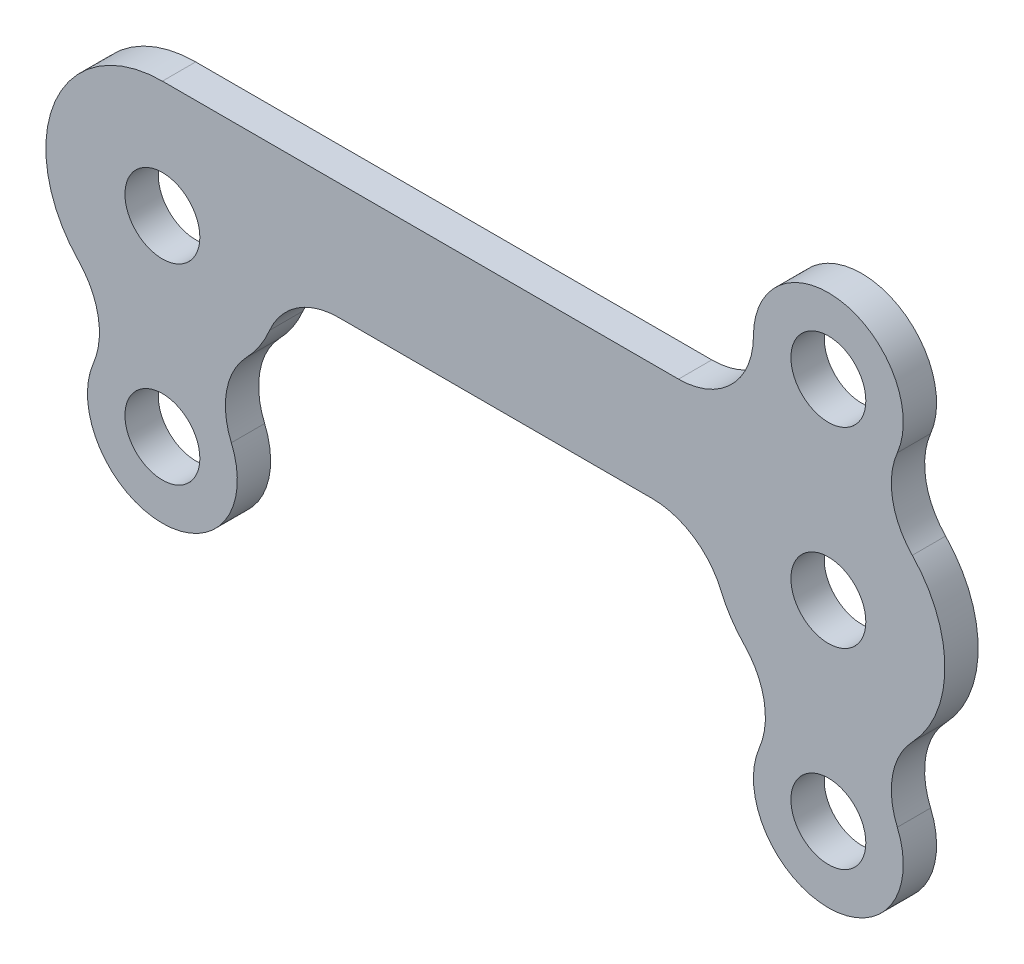
ISO-10303-21;
HEADER;
FILE_DESCRIPTION(('STEP AP214'),'2;1');
FILE_NAME('part.step','',(''),(''),'','','');
FILE_SCHEMA(('AUTOMOTIVE_DESIGN { 1 0 10303 214 1 1 1 1 }'));
ENDSEC;
DATA;
#1=APPLICATION_CONTEXT('core data for automotive mechanical design processes');
#2=APPLICATION_PROTOCOL_DEFINITION('international standard','automotive_design',2000,#1);
#3=PRODUCT_CONTEXT('',#1,'mechanical');
#4=PRODUCT('Part','Part','',(#3));
#5=PRODUCT_RELATED_PRODUCT_CATEGORY('part','',(#4));
#6=PRODUCT_DEFINITION_FORMATION('','',#4);
#7=PRODUCT_DEFINITION_CONTEXT('part definition',#1,'design');
#8=PRODUCT_DEFINITION('design','',#6,#7);
#9=PRODUCT_DEFINITION_SHAPE('','',#8);
#10=(LENGTH_UNIT() NAMED_UNIT(*) SI_UNIT(.MILLI.,.METRE.));
#11=(NAMED_UNIT(*) PLANE_ANGLE_UNIT() SI_UNIT($,.RADIAN.));
#12=(NAMED_UNIT(*) SI_UNIT($,.STERADIAN.) SOLID_ANGLE_UNIT());
#13=UNCERTAINTY_MEASURE_WITH_UNIT(LENGTH_MEASURE(1.E-05),#10,'distance_accuracy_value','');
#14=(GEOMETRIC_REPRESENTATION_CONTEXT(3) GLOBAL_UNCERTAINTY_ASSIGNED_CONTEXT((#13)) GLOBAL_UNIT_ASSIGNED_CONTEXT((#10,
#11,#12)) REPRESENTATION_CONTEXT('',''));
#15=CARTESIAN_POINT('',(0.,0.,0.));
#16=DIRECTION('',(0.,0.,1.));
#17=DIRECTION('',(1.,0.,0.));
#18=AXIS2_PLACEMENT_3D('',#15,#16,#17);
#19=CARTESIAN_POINT('',(31.75,9.128125,1.5875));
#20=DIRECTION('',(0.,0.,-1.));
#21=DIRECTION('',(-1.,0.,0.));
#22=AXIS2_PLACEMENT_3D('',#19,#20,#21);
#23=CYLINDRICAL_SURFACE('',#22,3.57187499999999);
#24=CARTESIAN_POINT('',(31.75,9.128125,0.));
#25=DIRECTION('',(0.,0.,1.));
#26=DIRECTION('',(1.,0.,0.));
#27=AXIS2_PLACEMENT_3D('',#24,#25,#26);
#28=CIRCLE('',#27,3.57187499999999);
#29=CARTESIAN_POINT('',(35.0370584223335,7.7304347826087,0.));
#30=VERTEX_POINT('',#29);
#31=CARTESIAN_POINT('',(28.178125,9.128125,0.));
#32=VERTEX_POINT('',#31);
#33=EDGE_CURVE('E177',#30,#32,#28,.T.);
#34=ORIENTED_EDGE('',*,*,#33,.T.);
#35=DIRECTION('',(0.,0.,-1.));
#36=VECTOR('',#35,1.);
#37=CARTESIAN_POINT('',(28.178125,9.128125,1.5875));
#38=LINE('',#37,#36);
#39=CARTESIAN_POINT('',(28.178125,9.128125,1.5875));
#40=VERTEX_POINT('',#39);
#41=EDGE_CURVE('E175',#40,#32,#38,.T.);
#42=ORIENTED_EDGE('',*,*,#41,.F.);
#43=CARTESIAN_POINT('',(31.75,9.128125,1.5875));
#44=DIRECTION('',(0.,0.,1.));
#45=DIRECTION('',(1.,0.,0.));
#46=AXIS2_PLACEMENT_3D('',#43,#44,#45);
#47=CIRCLE('',#46,3.57187499999999);
#48=CARTESIAN_POINT('',(35.0370584223335,7.7304347826087,1.5875));
#49=VERTEX_POINT('',#48);
#50=EDGE_CURVE('E160',#49,#40,#47,.T.);
#51=ORIENTED_EDGE('',*,*,#50,.F.);
#52=DIRECTION('',(0.,0.,-1.));
#53=VECTOR('',#52,1.);
#54=CARTESIAN_POINT('',(35.0370584223335,7.7304347826087,1.5875));
#55=LINE('',#54,#53);
#56=EDGE_CURVE('E244',#49,#30,#55,.T.);
#57=ORIENTED_EDGE('',*,*,#56,.T.);
#58=EDGE_LOOP('',(#34,#42,#51,#57));
#59=FACE_BOUND('',#58,.T.);
#60=ADVANCED_FACE('F41',(#59),#23,.T.);
#61=CARTESIAN_POINT('',(24.60625,9.128125,1.5875));
#62=DIRECTION('',(0.,0.,-1.));
#63=DIRECTION('',(-1.,0.,0.));
#64=AXIS2_PLACEMENT_3D('',#61,#62,#63);
#65=CYLINDRICAL_SURFACE('',#64,3.571875);
#66=CARTESIAN_POINT('',(24.60625,9.128125,0.));
#67=DIRECTION('',(0.,0.,1.));
#68=DIRECTION('',(1.,0.,0.));
#69=AXIS2_PLACEMENT_3D('',#66,#67,#68);
#70=CIRCLE('',#69,3.571875);
#71=CARTESIAN_POINT('',(24.60625,5.55625,0.));
#72=VERTEX_POINT('',#71);
#73=EDGE_CURVE('E251',#72,#32,#70,.T.);
#74=ORIENTED_EDGE('',*,*,#73,.F.);
#75=DIRECTION('',(0.,0.,-1.));
#76=VECTOR('',#75,1.);
#77=CARTESIAN_POINT('',(24.60625,5.55625,1.5875));
#78=LINE('',#77,#76);
#79=CARTESIAN_POINT('',(24.60625,5.55625,1.5875));
#80=VERTEX_POINT('',#79);
#81=EDGE_CURVE('E183',#80,#72,#78,.T.);
#82=ORIENTED_EDGE('',*,*,#81,.F.);
#83=CARTESIAN_POINT('',(24.60625,9.128125,1.5875));
#84=DIRECTION('',(0.,0.,1.));
#85=DIRECTION('',(1.,0.,0.));
#86=AXIS2_PLACEMENT_3D('',#83,#84,#85);
#87=CIRCLE('',#86,3.571875);
#88=EDGE_CURVE('E166',#80,#40,#87,.T.);
#89=ORIENTED_EDGE('',*,*,#88,.T.);
#90=ORIENTED_EDGE('',*,*,#41,.T.);
#91=EDGE_LOOP('',(#74,#82,#89,#90));
#92=FACE_BOUND('',#91,.T.);
#93=ADVANCED_FACE('F185',(#92),#65,.F.);
#94=CARTESIAN_POINT('',(0.,5.55625000000001,1.5875));
#95=DIRECTION('',(0.,1.,0.));
#96=DIRECTION('',(-1.,0.,0.));
#97=AXIS2_PLACEMENT_3D('',#94,#95,#96);
#98=PLANE('',#97);
#99=DIRECTION('',(1.,0.,0.));
#100=VECTOR('',#99,1.);
#101=CARTESIAN_POINT('',(0.,5.55625000000001,0.));
#102=LINE('',#101,#100);
#103=CARTESIAN_POINT('',(0.,5.55625000000001,0.));
#104=VERTEX_POINT('',#103);
#105=EDGE_CURVE('E254',#104,#72,#102,.T.);
#106=ORIENTED_EDGE('',*,*,#105,.F.);
#107=DIRECTION('',(0.,0.,-1.));
#108=VECTOR('',#107,1.);
#109=CARTESIAN_POINT('',(0.,5.55625000000001,1.5875));
#110=LINE('',#109,#108);
#111=CARTESIAN_POINT('',(0.,5.55625000000001,1.5875));
#112=VERTEX_POINT('',#111);
#113=EDGE_CURVE('E345',#112,#104,#110,.T.);
#114=ORIENTED_EDGE('',*,*,#113,.F.);
#115=DIRECTION('',(1.,0.,0.));
#116=VECTOR('',#115,1.);
#117=CARTESIAN_POINT('',(0.,5.55625000000001,1.5875));
#118=LINE('',#117,#116);
#119=EDGE_CURVE('E187',#112,#80,#118,.T.);
#120=ORIENTED_EDGE('',*,*,#119,.T.);
#121=ORIENTED_EDGE('',*,*,#81,.T.);
#122=EDGE_LOOP('',(#106,#114,#120,#121));
#123=FACE_BOUND('',#122,.T.);
#124=ADVANCED_FACE('F406',(#123),#98,.T.);
#125=CARTESIAN_POINT('',(0.,0.,1.5875));
#126=DIRECTION('',(0.,0.,-1.));
#127=DIRECTION('',(-1.,0.,0.));
#128=AXIS2_PLACEMENT_3D('',#125,#126,#127);
#129=CYLINDRICAL_SURFACE('',#128,5.55625);
#130=CARTESIAN_POINT('',(0.,0.,0.));
#131=DIRECTION('',(0.,0.,1.));
#132=DIRECTION('',(1.,0.,0.));
#133=AXIS2_PLACEMENT_3D('',#130,#131,#132);
#134=CIRCLE('',#133,5.55625);
#135=CARTESIAN_POINT('',(-4.0016363402321,-3.8547140831758,0.));
#136=VERTEX_POINT('',#135);
#137=EDGE_CURVE('E258',#104,#136,#134,.T.);
#138=ORIENTED_EDGE('',*,*,#137,.T.);
#139=DIRECTION('',(0.,0.,-1.));
#140=VECTOR('',#139,1.);
#141=CARTESIAN_POINT('',(-4.0016363402321,-3.8547140831758,1.5875));
#142=LINE('',#141,#140);
#143=CARTESIAN_POINT('',(-4.0016363402321,-3.8547140831758,1.5875));
#144=VERTEX_POINT('',#143);
#145=EDGE_CURVE('E342',#144,#136,#142,.T.);
#146=ORIENTED_EDGE('',*,*,#145,.F.);
#147=CARTESIAN_POINT('',(0.,0.,1.5875));
#148=DIRECTION('',(0.,0.,1.));
#149=DIRECTION('',(1.,0.,0.));
#150=AXIS2_PLACEMENT_3D('',#147,#148,#149);
#151=CIRCLE('',#150,5.55625);
#152=EDGE_CURVE('E190',#112,#144,#151,.T.);
#153=ORIENTED_EDGE('',*,*,#152,.F.);
#154=ORIENTED_EDGE('',*,*,#113,.T.);
#155=EDGE_LOOP('',(#138,#146,#153,#154));
#156=FACE_BOUND('',#155,.T.);
#157=ADVANCED_FACE('F411',(#156),#129,.T.);
#158=CARTESIAN_POINT('',(-6.57411684466701,-6.33274456521739,1.5875));
#159=DIRECTION('',(0.,0.,-1.));
#160=DIRECTION('',(-1.,0.,0.));
#161=AXIS2_PLACEMENT_3D('',#158,#159,#160);
#162=CYLINDRICAL_SURFACE('',#161,3.57187499999999);
#163=CARTESIAN_POINT('',(-6.57411684466701,-6.33274456521739,0.));
#164=DIRECTION('',(0.,0.,1.));
#165=DIRECTION('',(1.,0.,0.));
#166=AXIS2_PLACEMENT_3D('',#163,#164,#165);
#167=CIRCLE('',#166,3.57187499999999);
#168=CARTESIAN_POINT('',(-3.2870584223335,-7.73043478260869,0.));
#169=VERTEX_POINT('',#168);
#170=EDGE_CURVE('E262',#169,#136,#167,.T.);
#171=ORIENTED_EDGE('',*,*,#170,.F.);
#172=DIRECTION('',(0.,0.,-1.));
#173=VECTOR('',#172,1.);
#174=CARTESIAN_POINT('',(-3.2870584223335,-7.73043478260869,1.5875));
#175=LINE('',#174,#173);
#176=CARTESIAN_POINT('',(-3.2870584223335,-7.73043478260869,1.5875));
#177=VERTEX_POINT('',#176);
#178=EDGE_CURVE('E339',#177,#169,#175,.T.);
#179=ORIENTED_EDGE('',*,*,#178,.F.);
#180=CARTESIAN_POINT('',(-6.57411684466701,-6.33274456521739,1.5875));
#181=DIRECTION('',(0.,0.,1.));
#182=DIRECTION('',(1.,0.,0.));
#183=AXIS2_PLACEMENT_3D('',#180,#181,#182);
#184=CIRCLE('',#183,3.57187499999999);
#185=EDGE_CURVE('E196',#177,#144,#184,.T.);
#186=ORIENTED_EDGE('',*,*,#185,.T.);
#187=ORIENTED_EDGE('',*,*,#145,.T.);
#188=EDGE_LOOP('',(#171,#179,#186,#187));
#189=FACE_BOUND('',#188,.T.);
#190=ADVANCED_FACE('F414',(#189),#162,.F.);
#191=CARTESIAN_POINT('',(0.,-9.128125,1.5875));
#192=DIRECTION('',(0.,0.,-1.));
#193=DIRECTION('',(-1.,0.,0.));
#194=AXIS2_PLACEMENT_3D('',#191,#192,#193);
#195=CYLINDRICAL_SURFACE('',#194,3.57187499999999);
#196=CARTESIAN_POINT('',(0.,-9.128125,0.));
#197=DIRECTION('',(0.,0.,1.));
#198=DIRECTION('',(1.,0.,0.));
#199=AXIS2_PLACEMENT_3D('',#196,#197,#198);
#200=CIRCLE('',#199,3.57187499999999);
#201=CARTESIAN_POINT('',(3.2870584223335,-7.73043478260869,0.));
#202=VERTEX_POINT('',#201);
#203=EDGE_CURVE('E267',#169,#202,#200,.T.);
#204=ORIENTED_EDGE('',*,*,#203,.T.);
#205=DIRECTION('',(0.,0.,-1.));
#206=VECTOR('',#205,1.);
#207=CARTESIAN_POINT('',(3.2870584223335,-7.73043478260869,1.5875));
#208=LINE('',#207,#206);
#209=CARTESIAN_POINT('',(3.2870584223335,-7.73043478260869,1.5875));
#210=VERTEX_POINT('',#209);
#211=EDGE_CURVE('E336',#210,#202,#208,.T.);
#212=ORIENTED_EDGE('',*,*,#211,.F.);
#213=CARTESIAN_POINT('',(0.,-9.128125,1.5875));
#214=DIRECTION('',(0.,0.,1.));
#215=DIRECTION('',(1.,0.,0.));
#216=AXIS2_PLACEMENT_3D('',#213,#214,#215);
#217=CIRCLE('',#216,3.57187499999999);
#218=EDGE_CURVE('E201',#177,#210,#217,.T.);
#219=ORIENTED_EDGE('',*,*,#218,.F.);
#220=ORIENTED_EDGE('',*,*,#178,.T.);
#221=EDGE_LOOP('',(#204,#212,#219,#220));
#222=FACE_BOUND('',#221,.T.);
#223=ADVANCED_FACE('F419',(#222),#195,.T.);
#224=CARTESIAN_POINT('',(6.57411684466701,-6.33274456521739,1.5875));
#225=DIRECTION('',(0.,0.,-1.));
#226=DIRECTION('',(-1.,0.,0.));
#227=AXIS2_PLACEMENT_3D('',#224,#225,#226);
#228=CYLINDRICAL_SURFACE('',#227,3.57187500000001);
#229=CARTESIAN_POINT('',(6.57411684466701,-6.33274456521739,0.));
#230=DIRECTION('',(0.,0.,1.));
#231=DIRECTION('',(1.,0.,0.));
#232=AXIS2_PLACEMENT_3D('',#229,#230,#231);
#233=CIRCLE('',#232,3.57187500000001);
#234=CARTESIAN_POINT('',(4.0016363402321,-3.8547140831758,0.));
#235=VERTEX_POINT('',#234);
#236=EDGE_CURVE('E271',#235,#202,#233,.T.);
#237=ORIENTED_EDGE('',*,*,#236,.F.);
#238=DIRECTION('',(0.,0.,-1.));
#239=VECTOR('',#238,1.);
#240=CARTESIAN_POINT('',(4.0016363402321,-3.8547140831758,1.5875));
#241=LINE('',#240,#239);
#242=CARTESIAN_POINT('',(4.0016363402321,-3.8547140831758,1.5875));
#243=VERTEX_POINT('',#242);
#244=EDGE_CURVE('E333',#243,#235,#241,.T.);
#245=ORIENTED_EDGE('',*,*,#244,.F.);
#246=CARTESIAN_POINT('',(6.57411684466701,-6.33274456521739,1.5875));
#247=DIRECTION('',(0.,0.,1.));
#248=DIRECTION('',(1.,0.,0.));
#249=AXIS2_PLACEMENT_3D('',#246,#247,#248);
#250=CIRCLE('',#249,3.57187500000001);
#251=EDGE_CURVE('E204',#243,#210,#250,.T.);
#252=ORIENTED_EDGE('',*,*,#251,.T.);
#253=ORIENTED_EDGE('',*,*,#211,.T.);
#254=EDGE_LOOP('',(#237,#245,#252,#253));
#255=FACE_BOUND('',#254,.T.);
#256=ADVANCED_FACE('F426',(#255),#228,.F.);
#257=CARTESIAN_POINT('',(5.11320199029657,-2.1741847826087,0.));
#258=VERTEX_POINT('',#257);
#259=EDGE_CURVE('E263',#235,#258,#134,.T.);
#260=ORIENTED_EDGE('',*,*,#259,.T.);
#261=DIRECTION('',(0.,0.,-1.));
#262=VECTOR('',#261,1.);
#263=CARTESIAN_POINT('',(5.11320199029657,-2.1741847826087,1.5875));
#264=LINE('',#263,#262);
#265=CARTESIAN_POINT('',(5.11320199029657,-2.1741847826087,1.5875));
#266=VERTEX_POINT('',#265);
#267=EDGE_CURVE('E356',#258,#266,#264,.F.);
#268=ORIENTED_EDGE('',*,*,#267,.T.);
#269=EDGE_CURVE('E197',#243,#266,#151,.T.);
#270=ORIENTED_EDGE('',*,*,#269,.F.);
#271=ORIENTED_EDGE('',*,*,#244,.T.);
#272=EDGE_LOOP('',(#260,#268,#270,#271));
#273=FACE_BOUND('',#272,.T.);
#274=ADVANCED_FACE('F430',(#273),#129,.T.);
#275=CARTESIAN_POINT('',(0.,0.,1.5875));
#276=DIRECTION('',(0.,1.,0.));
#277=DIRECTION('',(0.,0.,1.));
#278=AXIS2_PLACEMENT_3D('',#275,#276,#277);
#279=PLANE('',#278);
#280=DIRECTION('',(1.,0.,0.));
#281=VECTOR('',#280,1.);
#282=CARTESIAN_POINT('',(0.,0.,1.5875));
#283=LINE('',#282,#281);
#284=CARTESIAN_POINT('',(8.40026041263008,0.,1.5875));
#285=VERTEX_POINT('',#284);
#286=CARTESIAN_POINT('',(23.3497395873699,0.,1.5875));
#287=VERTEX_POINT('',#286);
#288=EDGE_CURVE('E208',#285,#287,#283,.T.);
#289=ORIENTED_EDGE('',*,*,#288,.F.);
#290=DIRECTION('',(0.,0.,1.));
#291=VECTOR('',#290,1.);
#292=CARTESIAN_POINT('',(8.40026041263008,0.,0.));
#293=LINE('',#292,#291);
#294=CARTESIAN_POINT('',(8.40026041263008,0.,0.));
#295=VERTEX_POINT('',#294);
#296=EDGE_CURVE('E352',#285,#295,#293,.F.);
#297=ORIENTED_EDGE('',*,*,#296,.T.);
#298=DIRECTION('',(1.,0.,0.));
#299=VECTOR('',#298,1.);
#300=CARTESIAN_POINT('',(0.,0.,0.));
#301=LINE('',#300,#299);
#302=CARTESIAN_POINT('',(23.3497395873699,0.,0.));
#303=VERTEX_POINT('',#302);
#304=EDGE_CURVE('E275',#295,#303,#301,.T.);
#305=ORIENTED_EDGE('',*,*,#304,.T.);
#306=DIRECTION('',(0.,0.,1.));
#307=VECTOR('',#306,1.);
#308=CARTESIAN_POINT('',(23.3497395873699,0.,1.5875));
#309=LINE('',#308,#307);
#310=EDGE_CURVE('E182',#303,#287,#309,.T.);
#311=ORIENTED_EDGE('',*,*,#310,.T.);
#312=EDGE_LOOP('',(#289,#297,#305,#311));
#313=FACE_BOUND('',#312,.T.);
#314=ADVANCED_FACE('F375',(#313),#279,.F.);
#315=CARTESIAN_POINT('',(31.75,0.,1.5875));
#316=DIRECTION('',(0.,0.,-1.));
#317=DIRECTION('',(-1.,0.,0.));
#318=AXIS2_PLACEMENT_3D('',#315,#316,#317);
#319=CYLINDRICAL_SURFACE('',#318,5.55625);
#320=CARTESIAN_POINT('',(31.75,0.,1.5875));
#321=DIRECTION('',(0.,0.,1.));
#322=DIRECTION('',(1.,0.,0.));
#323=AXIS2_PLACEMENT_3D('',#320,#321,#322);
#324=CIRCLE('',#323,5.55625);
#325=CARTESIAN_POINT('',(26.6367980097034,-2.17418478260869,1.5875));
#326=VERTEX_POINT('',#325);
#327=CARTESIAN_POINT('',(27.7483636597679,-3.8547140831758,1.5875));
#328=VERTEX_POINT('',#327);
#329=EDGE_CURVE('E211',#326,#328,#324,.T.);
#330=ORIENTED_EDGE('',*,*,#329,.F.);
#331=DIRECTION('',(0.,0.,-1.));
#332=VECTOR('',#331,1.);
#333=CARTESIAN_POINT('',(26.6367980097034,-2.17418478260869,1.5875));
#334=LINE('',#333,#332);
#335=CARTESIAN_POINT('',(26.6367980097034,-2.17418478260869,0.));
#336=VERTEX_POINT('',#335);
#337=EDGE_CURVE('E359',#326,#336,#334,.T.);
#338=ORIENTED_EDGE('',*,*,#337,.T.);
#339=CARTESIAN_POINT('',(31.75,0.,0.));
#340=DIRECTION('',(0.,0.,1.));
#341=DIRECTION('',(1.,0.,0.));
#342=AXIS2_PLACEMENT_3D('',#339,#340,#341);
#343=CIRCLE('',#342,5.55625);
#344=CARTESIAN_POINT('',(27.7483636597679,-3.8547140831758,0.));
#345=VERTEX_POINT('',#344);
#346=EDGE_CURVE('E279',#336,#345,#343,.T.);
#347=ORIENTED_EDGE('',*,*,#346,.T.);
#348=DIRECTION('',(0.,0.,-1.));
#349=VECTOR('',#348,1.);
#350=CARTESIAN_POINT('',(27.7483636597679,-3.8547140831758,1.5875));
#351=LINE('',#350,#349);
#352=EDGE_CURVE('E329',#328,#345,#351,.T.);
#353=ORIENTED_EDGE('',*,*,#352,.F.);
#354=EDGE_LOOP('',(#330,#338,#347,#353));
#355=FACE_BOUND('',#354,.T.);
#356=ADVANCED_FACE('F378',(#355),#319,.T.);
#357=CARTESIAN_POINT('',(25.175883155333,-6.33274456521739,1.5875));
#358=DIRECTION('',(0.,0.,-1.));
#359=DIRECTION('',(-1.,0.,0.));
#360=AXIS2_PLACEMENT_3D('',#357,#358,#359);
#361=CYLINDRICAL_SURFACE('',#360,3.57187499999999);
#362=CARTESIAN_POINT('',(25.175883155333,-6.33274456521739,0.));
#363=DIRECTION('',(0.,0.,1.));
#364=DIRECTION('',(1.,0.,0.));
#365=AXIS2_PLACEMENT_3D('',#362,#363,#364);
#366=CIRCLE('',#365,3.57187499999999);
#367=CARTESIAN_POINT('',(28.4629415776665,-7.73043478260869,0.));
#368=VERTEX_POINT('',#367);
#369=EDGE_CURVE('E282',#368,#345,#366,.T.);
#370=ORIENTED_EDGE('',*,*,#369,.F.);
#371=DIRECTION('',(0.,0.,-1.));
#372=VECTOR('',#371,1.);
#373=CARTESIAN_POINT('',(28.4629415776665,-7.73043478260869,1.5875));
#374=LINE('',#373,#372);
#375=CARTESIAN_POINT('',(28.4629415776665,-7.73043478260869,1.5875));
#376=VERTEX_POINT('',#375);
#377=EDGE_CURVE('E326',#376,#368,#374,.T.);
#378=ORIENTED_EDGE('',*,*,#377,.F.);
#379=CARTESIAN_POINT('',(25.175883155333,-6.33274456521739,1.5875));
#380=DIRECTION('',(0.,0.,1.));
#381=DIRECTION('',(1.,0.,0.));
#382=AXIS2_PLACEMENT_3D('',#379,#380,#381);
#383=CIRCLE('',#382,3.57187499999999);
#384=EDGE_CURVE('E214',#376,#328,#383,.T.);
#385=ORIENTED_EDGE('',*,*,#384,.T.);
#386=ORIENTED_EDGE('',*,*,#352,.T.);
#387=EDGE_LOOP('',(#370,#378,#385,#386));
#388=FACE_BOUND('',#387,.T.);
#389=ADVANCED_FACE('F386',(#388),#361,.F.);
#390=CARTESIAN_POINT('',(31.75,-9.128125,1.5875));
#391=DIRECTION('',(0.,0.,-1.));
#392=DIRECTION('',(-1.,0.,0.));
#393=AXIS2_PLACEMENT_3D('',#390,#391,#392);
#394=CYLINDRICAL_SURFACE('',#393,3.57187499999999);
#395=CARTESIAN_POINT('',(31.75,-9.128125,0.));
#396=DIRECTION('',(0.,0.,1.));
#397=DIRECTION('',(1.,0.,0.));
#398=AXIS2_PLACEMENT_3D('',#395,#396,#397);
#399=CIRCLE('',#398,3.57187499999999);
#400=CARTESIAN_POINT('',(35.0370584223335,-7.73043478260869,0.));
#401=VERTEX_POINT('',#400);
#402=EDGE_CURVE('E287',#368,#401,#399,.T.);
#403=ORIENTED_EDGE('',*,*,#402,.T.);
#404=DIRECTION('',(0.,0.,-1.));
#405=VECTOR('',#404,1.);
#406=CARTESIAN_POINT('',(35.0370584223335,-7.73043478260869,1.5875));
#407=LINE('',#406,#405);
#408=CARTESIAN_POINT('',(35.0370584223335,-7.73043478260869,1.5875));
#409=VERTEX_POINT('',#408);
#410=EDGE_CURVE('E323',#409,#401,#407,.T.);
#411=ORIENTED_EDGE('',*,*,#410,.F.);
#412=CARTESIAN_POINT('',(31.75,-9.128125,1.5875));
#413=DIRECTION('',(0.,0.,1.));
#414=DIRECTION('',(1.,0.,0.));
#415=AXIS2_PLACEMENT_3D('',#412,#413,#414);
#416=CIRCLE('',#415,3.57187499999999);
#417=EDGE_CURVE('E219',#376,#409,#416,.T.);
#418=ORIENTED_EDGE('',*,*,#417,.F.);
#419=ORIENTED_EDGE('',*,*,#377,.T.);
#420=EDGE_LOOP('',(#403,#411,#418,#419));
#421=FACE_BOUND('',#420,.T.);
#422=ADVANCED_FACE('F389',(#421),#394,.T.);
#423=CARTESIAN_POINT('',(38.324116844667,-6.33274456521739,1.5875));
#424=DIRECTION('',(0.,0.,-1.));
#425=DIRECTION('',(-1.,0.,0.));
#426=AXIS2_PLACEMENT_3D('',#423,#424,#425);
#427=CYLINDRICAL_SURFACE('',#426,3.571875);
#428=CARTESIAN_POINT('',(38.324116844667,-6.33274456521739,0.));
#429=DIRECTION('',(0.,0.,1.));
#430=DIRECTION('',(1.,0.,0.));
#431=AXIS2_PLACEMENT_3D('',#428,#429,#430);
#432=CIRCLE('',#431,3.571875);
#433=CARTESIAN_POINT('',(35.7516363402321,-3.8547140831758,0.));
#434=VERTEX_POINT('',#433);
#435=EDGE_CURVE('E291',#434,#401,#432,.T.);
#436=ORIENTED_EDGE('',*,*,#435,.F.);
#437=DIRECTION('',(0.,0.,-1.));
#438=VECTOR('',#437,1.);
#439=CARTESIAN_POINT('',(35.7516363402321,-3.8547140831758,1.5875));
#440=LINE('',#439,#438);
#441=CARTESIAN_POINT('',(35.7516363402321,-3.8547140831758,1.5875));
#442=VERTEX_POINT('',#441);
#443=EDGE_CURVE('E320',#442,#434,#440,.T.);
#444=ORIENTED_EDGE('',*,*,#443,.F.);
#445=CARTESIAN_POINT('',(38.324116844667,-6.33274456521739,1.5875));
#446=DIRECTION('',(0.,0.,1.));
#447=DIRECTION('',(1.,0.,0.));
#448=AXIS2_PLACEMENT_3D('',#445,#446,#447);
#449=CIRCLE('',#448,3.571875);
#450=EDGE_CURVE('E222',#442,#409,#449,.T.);
#451=ORIENTED_EDGE('',*,*,#450,.T.);
#452=ORIENTED_EDGE('',*,*,#410,.T.);
#453=EDGE_LOOP('',(#436,#444,#451,#452));
#454=FACE_BOUND('',#453,.T.);
#455=ADVANCED_FACE('F392',(#454),#427,.F.);
#456=CARTESIAN_POINT('',(35.7516363402321,3.85471408317581,0.));
#457=VERTEX_POINT('',#456);
#458=EDGE_CURVE('E283',#434,#457,#343,.T.);
#459=ORIENTED_EDGE('',*,*,#458,.T.);
#460=DIRECTION('',(0.,0.,-1.));
#461=VECTOR('',#460,1.);
#462=CARTESIAN_POINT('',(35.7516363402321,3.85471408317581,1.5875));
#463=LINE('',#462,#461);
#464=CARTESIAN_POINT('',(35.7516363402321,3.85471408317581,1.5875));
#465=VERTEX_POINT('',#464);
#466=EDGE_CURVE('E317',#465,#457,#463,.T.);
#467=ORIENTED_EDGE('',*,*,#466,.F.);
#468=EDGE_CURVE('E215',#442,#465,#324,.T.);
#469=ORIENTED_EDGE('',*,*,#468,.F.);
#470=ORIENTED_EDGE('',*,*,#443,.T.);
#471=EDGE_LOOP('',(#459,#467,#469,#470));
#472=FACE_BOUND('',#471,.T.);
#473=ADVANCED_FACE('F398',(#472),#319,.T.);
#474=CARTESIAN_POINT('',(0.,-9.128125,1.5875));
#475=DIRECTION('',(0.,0.,-1.));
#476=DIRECTION('',(-1.,0.,0.));
#477=AXIS2_PLACEMENT_3D('',#474,#475,#476);
#478=CYLINDRICAL_SURFACE('',#477,1.7859375);
#479=CARTESIAN_POINT('',(0.,-9.128125,1.5875));
#480=DIRECTION('',(0.,0.,1.));
#481=DIRECTION('',(1.,0.,0.));
#482=AXIS2_PLACEMENT_3D('',#479,#480,#481);
#483=CIRCLE('',#482,1.7859375);
#484=CARTESIAN_POINT('',(1.7859375,-9.128125,1.5875));
#485=VERTEX_POINT('',#484);
#486=EDGE_CURVE('E236',#485,#485,#483,.T.);
#487=ORIENTED_EDGE('',*,*,#486,.T.);
#488=EDGE_LOOP('',(#487));
#489=FACE_BOUND('',#488,.T.);
#490=CARTESIAN_POINT('',(0.,-9.128125,0.));
#491=DIRECTION('',(0.,0.,1.));
#492=DIRECTION('',(1.,0.,0.));
#493=AXIS2_PLACEMENT_3D('',#490,#491,#492);
#494=CIRCLE('',#493,1.7859375);
#495=CARTESIAN_POINT('',(1.7859375,-9.128125,0.));
#496=VERTEX_POINT('',#495);
#497=EDGE_CURVE('E307',#496,#496,#494,.T.);
#498=ORIENTED_EDGE('',*,*,#497,.F.);
#499=EDGE_LOOP('',(#498));
#500=FACE_BOUND('',#499,.T.);
#501=ADVANCED_FACE('F557',(#489,#500),#478,.F.);
#502=CARTESIAN_POINT('',(31.75,0.,1.5875));
#503=DIRECTION('',(0.,0.,-1.));
#504=DIRECTION('',(-1.,0.,0.));
#505=AXIS2_PLACEMENT_3D('',#502,#503,#504);
#506=CYLINDRICAL_SURFACE('',#505,1.7859375);
#507=CARTESIAN_POINT('',(31.75,0.,1.5875));
#508=DIRECTION('',(0.,0.,1.));
#509=DIRECTION('',(1.,0.,0.));
#510=AXIS2_PLACEMENT_3D('',#507,#508,#509);
#511=CIRCLE('',#510,1.7859375);
#512=CARTESIAN_POINT('',(33.5359375,0.,1.5875));
#513=VERTEX_POINT('',#512);
#514=EDGE_CURVE('E232',#513,#513,#511,.T.);
#515=ORIENTED_EDGE('',*,*,#514,.T.);
#516=EDGE_LOOP('',(#515));
#517=FACE_BOUND('',#516,.T.);
#518=CARTESIAN_POINT('',(31.75,0.,0.));
#519=DIRECTION('',(0.,0.,1.));
#520=DIRECTION('',(1.,0.,0.));
#521=AXIS2_PLACEMENT_3D('',#518,#519,#520);
#522=CIRCLE('',#521,1.7859375);
#523=CARTESIAN_POINT('',(33.5359375,0.,0.));
#524=VERTEX_POINT('',#523);
#525=EDGE_CURVE('E303',#524,#524,#522,.T.);
#526=ORIENTED_EDGE('',*,*,#525,.F.);
#527=EDGE_LOOP('',(#526));
#528=FACE_BOUND('',#527,.T.);
#529=ADVANCED_FACE('F547',(#517,#528),#506,.F.);
#530=CARTESIAN_POINT('',(0.,0.,1.5875));
#531=DIRECTION('',(0.,0.,-1.));
#532=DIRECTION('',(-1.,0.,0.));
#533=AXIS2_PLACEMENT_3D('',#530,#531,#532);
#534=CYLINDRICAL_SURFACE('',#533,1.7859375);
#535=CARTESIAN_POINT('',(0.,0.,1.5875));
#536=DIRECTION('',(0.,0.,1.));
#537=DIRECTION('',(1.,0.,0.));
#538=AXIS2_PLACEMENT_3D('',#535,#536,#537);
#539=CIRCLE('',#538,1.7859375);
#540=CARTESIAN_POINT('',(1.7859375,0.,1.5875));
#541=VERTEX_POINT('',#540);
#542=EDGE_CURVE('E228',#541,#541,#539,.T.);
#543=ORIENTED_EDGE('',*,*,#542,.T.);
#544=EDGE_LOOP('',(#543));
#545=FACE_BOUND('',#544,.T.);
#546=CARTESIAN_POINT('',(0.,0.,0.));
#547=DIRECTION('',(0.,0.,1.));
#548=DIRECTION('',(1.,0.,0.));
#549=AXIS2_PLACEMENT_3D('',#546,#547,#548);
#550=CIRCLE('',#549,1.7859375);
#551=CARTESIAN_POINT('',(1.7859375,0.,0.));
#552=VERTEX_POINT('',#551);
#553=EDGE_CURVE('E299',#552,#552,#550,.T.);
#554=ORIENTED_EDGE('',*,*,#553,.F.);
#555=EDGE_LOOP('',(#554));
#556=FACE_BOUND('',#555,.T.);
#557=ADVANCED_FACE('F538',(#545,#556),#534,.F.);
#558=CARTESIAN_POINT('',(38.324116844667,6.33274456521739,1.5875));
#559=DIRECTION('',(0.,0.,-1.));
#560=DIRECTION('',(-1.,0.,0.));
#561=AXIS2_PLACEMENT_3D('',#558,#559,#560);
#562=CYLINDRICAL_SURFACE('',#561,3.571875);
#563=CARTESIAN_POINT('',(38.324116844667,6.33274456521739,0.));
#564=DIRECTION('',(0.,0.,1.));
#565=DIRECTION('',(1.,0.,0.));
#566=AXIS2_PLACEMENT_3D('',#563,#564,#565);
#567=CIRCLE('',#566,3.571875);
#568=EDGE_CURVE('E295',#30,#457,#567,.T.);
#569=ORIENTED_EDGE('',*,*,#568,.F.);
#570=ORIENTED_EDGE('',*,*,#56,.F.);
#571=CARTESIAN_POINT('',(38.324116844667,6.33274456521739,1.5875));
#572=DIRECTION('',(0.,0.,1.));
#573=DIRECTION('',(1.,0.,0.));
#574=AXIS2_PLACEMENT_3D('',#571,#572,#573);
#575=CIRCLE('',#574,3.571875);
#576=EDGE_CURVE('E169',#49,#465,#575,.T.);
#577=ORIENTED_EDGE('',*,*,#576,.T.);
#578=ORIENTED_EDGE('',*,*,#466,.T.);
#579=EDGE_LOOP('',(#569,#570,#577,#578));
#580=FACE_BOUND('',#579,.T.);
#581=ADVANCED_FACE('F402',(#580),#562,.F.);
#582=CARTESIAN_POINT('',(31.75,9.128125,1.5875));
#583=DIRECTION('',(0.,0.,-1.));
#584=DIRECTION('',(-1.,0.,0.));
#585=AXIS2_PLACEMENT_3D('',#582,#583,#584);
#586=CYLINDRICAL_SURFACE('',#585,1.7859375);
#587=CARTESIAN_POINT('',(31.75,9.128125,1.5875));
#588=DIRECTION('',(0.,0.,1.));
#589=DIRECTION('',(1.,0.,0.));
#590=AXIS2_PLACEMENT_3D('',#587,#588,#589);
#591=CIRCLE('',#590,1.7859375);
#592=CARTESIAN_POINT('',(33.5359375,9.128125,1.5875));
#593=VERTEX_POINT('',#592);
#594=EDGE_CURVE('E172',#593,#593,#591,.T.);
#595=ORIENTED_EDGE('',*,*,#594,.T.);
#596=EDGE_LOOP('',(#595));
#597=FACE_BOUND('',#596,.T.);
#598=CARTESIAN_POINT('',(31.75,9.128125,0.));
#599=DIRECTION('',(0.,0.,1.));
#600=DIRECTION('',(1.,0.,0.));
#601=AXIS2_PLACEMENT_3D('',#598,#599,#600);
#602=CIRCLE('',#601,1.7859375);
#603=CARTESIAN_POINT('',(33.5359375,9.128125,0.));
#604=VERTEX_POINT('',#603);
#605=EDGE_CURVE('E245',#604,#604,#602,.T.);
#606=ORIENTED_EDGE('',*,*,#605,.F.);
#607=EDGE_LOOP('',(#606));
#608=FACE_BOUND('',#607,.T.);
#609=ADVANCED_FACE('F441',(#597,#608),#586,.F.);
#610=CARTESIAN_POINT('',(31.75,-9.128125,1.5875));
#611=DIRECTION('',(0.,0.,-1.));
#612=DIRECTION('',(-1.,0.,0.));
#613=AXIS2_PLACEMENT_3D('',#610,#611,#612);
#614=CYLINDRICAL_SURFACE('',#613,1.7859375);
#615=CARTESIAN_POINT('',(31.75,-9.128125,1.5875));
#616=DIRECTION('',(0.,0.,1.));
#617=DIRECTION('',(1.,0.,0.));
#618=AXIS2_PLACEMENT_3D('',#615,#616,#617);
#619=CIRCLE('',#618,1.7859375);
#620=CARTESIAN_POINT('',(33.5359375,-9.128125,1.5875));
#621=VERTEX_POINT('',#620);
#622=EDGE_CURVE('E240',#621,#621,#619,.T.);
#623=ORIENTED_EDGE('',*,*,#622,.T.);
#624=EDGE_LOOP('',(#623));
#625=FACE_BOUND('',#624,.T.);
#626=CARTESIAN_POINT('',(31.75,-9.128125,0.));
#627=DIRECTION('',(0.,0.,1.));
#628=DIRECTION('',(1.,0.,0.));
#629=AXIS2_PLACEMENT_3D('',#626,#627,#628);
#630=CIRCLE('',#629,1.7859375);
#631=CARTESIAN_POINT('',(33.5359375,-9.128125,0.));
#632=VERTEX_POINT('',#631);
#633=EDGE_CURVE('E311',#632,#632,#630,.T.);
#634=ORIENTED_EDGE('',*,*,#633,.F.);
#635=EDGE_LOOP('',(#634));
#636=FACE_BOUND('',#635,.T.);
#637=ADVANCED_FACE('F445',(#625,#636),#614,.F.);
#638=CARTESIAN_POINT('',(0.,0.,1.5875));
#639=DIRECTION('',(0.,0.,1.));
#640=DIRECTION('',(1.,0.,0.));
#641=AXIS2_PLACEMENT_3D('',#638,#639,#640);
#642=PLANE('',#641);
#643=ORIENTED_EDGE('',*,*,#594,.F.);
#644=EDGE_LOOP('',(#643));
#645=FACE_BOUND('',#644,.T.);
#646=ORIENTED_EDGE('',*,*,#50,.T.);
#647=ORIENTED_EDGE('',*,*,#88,.F.);
#648=ORIENTED_EDGE('',*,*,#119,.F.);
#649=ORIENTED_EDGE('',*,*,#152,.T.);
#650=ORIENTED_EDGE('',*,*,#185,.F.);
#651=ORIENTED_EDGE('',*,*,#218,.T.);
#652=ORIENTED_EDGE('',*,*,#251,.F.);
#653=ORIENTED_EDGE('',*,*,#269,.T.);
#654=CARTESIAN_POINT('',(8.40026041263008,-3.571875,1.5875));
#655=DIRECTION('',(0.,0.,1.));
#656=DIRECTION('',(1.,0.,0.));
#657=AXIS2_PLACEMENT_3D('',#654,#655,#656);
#658=CIRCLE('',#657,3.571875);
#659=EDGE_CURVE('E365',#266,#285,#658,.F.);
#660=ORIENTED_EDGE('',*,*,#659,.T.);
#661=ORIENTED_EDGE('',*,*,#288,.T.);
#662=CARTESIAN_POINT('',(23.3497395873699,-3.571875,1.5875));
#663=DIRECTION('',(0.,0.,1.));
#664=DIRECTION('',(1.,0.,0.));
#665=AXIS2_PLACEMENT_3D('',#662,#663,#664);
#666=CIRCLE('',#665,3.571875);
#667=EDGE_CURVE('E11',#287,#326,#666,.F.);
#668=ORIENTED_EDGE('',*,*,#667,.T.);
#669=ORIENTED_EDGE('',*,*,#329,.T.);
#670=ORIENTED_EDGE('',*,*,#384,.F.);
#671=ORIENTED_EDGE('',*,*,#417,.T.);
#672=ORIENTED_EDGE('',*,*,#450,.F.);
#673=ORIENTED_EDGE('',*,*,#468,.T.);
#674=ORIENTED_EDGE('',*,*,#576,.F.);
#675=EDGE_LOOP('',(#646,#647,#648,#649,#650,#651,#652,#653,#660,#661,#668,#669,#670,#671,#672,
#673,#674));
#676=FACE_BOUND('',#675,.T.);
#677=ORIENTED_EDGE('',*,*,#542,.F.);
#678=EDGE_LOOP('',(#677));
#679=FACE_BOUND('',#678,.T.);
#680=ORIENTED_EDGE('',*,*,#514,.F.);
#681=EDGE_LOOP('',(#680));
#682=FACE_BOUND('',#681,.T.);
#683=ORIENTED_EDGE('',*,*,#486,.F.);
#684=EDGE_LOOP('',(#683));
#685=FACE_BOUND('',#684,.T.);
#686=ORIENTED_EDGE('',*,*,#622,.F.);
#687=EDGE_LOOP('',(#686));
#688=FACE_BOUND('',#687,.T.);
#689=ADVANCED_FACE('F162',(#645,#676,#679,#682,#685,#688),#642,.T.);
#690=CARTESIAN_POINT('',(0.,0.,0.));
#691=DIRECTION('',(0.,0.,1.));
#692=DIRECTION('',(1.,0.,0.));
#693=AXIS2_PLACEMENT_3D('',#690,#691,#692);
#694=PLANE('',#693);
#695=ORIENTED_EDGE('',*,*,#605,.T.);
#696=EDGE_LOOP('',(#695));
#697=FACE_BOUND('',#696,.T.);
#698=ORIENTED_EDGE('',*,*,#33,.F.);
#699=ORIENTED_EDGE('',*,*,#568,.T.);
#700=ORIENTED_EDGE('',*,*,#458,.F.);
#701=ORIENTED_EDGE('',*,*,#435,.T.);
#702=ORIENTED_EDGE('',*,*,#402,.F.);
#703=ORIENTED_EDGE('',*,*,#369,.T.);
#704=ORIENTED_EDGE('',*,*,#346,.F.);
#705=CARTESIAN_POINT('',(23.3497395873699,-3.571875,0.));
#706=DIRECTION('',(0.,0.,1.));
#707=DIRECTION('',(1.,0.,0.));
#708=AXIS2_PLACEMENT_3D('',#705,#706,#707);
#709=CIRCLE('',#708,3.571875);
#710=EDGE_CURVE('E50',#336,#303,#709,.T.);
#711=ORIENTED_EDGE('',*,*,#710,.T.);
#712=ORIENTED_EDGE('',*,*,#304,.F.);
#713=CARTESIAN_POINT('',(8.40026041263008,-3.571875,0.));
#714=DIRECTION('',(0.,0.,1.));
#715=DIRECTION('',(1.,0.,0.));
#716=AXIS2_PLACEMENT_3D('',#713,#714,#715);
#717=CIRCLE('',#716,3.571875);
#718=EDGE_CURVE('E362',#295,#258,#717,.T.);
#719=ORIENTED_EDGE('',*,*,#718,.T.);
#720=ORIENTED_EDGE('',*,*,#259,.F.);
#721=ORIENTED_EDGE('',*,*,#236,.T.);
#722=ORIENTED_EDGE('',*,*,#203,.F.);
#723=ORIENTED_EDGE('',*,*,#170,.T.);
#724=ORIENTED_EDGE('',*,*,#137,.F.);
#725=ORIENTED_EDGE('',*,*,#105,.T.);
#726=ORIENTED_EDGE('',*,*,#73,.T.);
#727=EDGE_LOOP('',(#698,#699,#700,#701,#702,#703,#704,#711,#712,#719,#720,#721,#722,#723,#724,
#725,#726));
#728=FACE_BOUND('',#727,.T.);
#729=ORIENTED_EDGE('',*,*,#553,.T.);
#730=EDGE_LOOP('',(#729));
#731=FACE_BOUND('',#730,.T.);
#732=ORIENTED_EDGE('',*,*,#525,.T.);
#733=EDGE_LOOP('',(#732));
#734=FACE_BOUND('',#733,.T.);
#735=ORIENTED_EDGE('',*,*,#497,.T.);
#736=EDGE_LOOP('',(#735));
#737=FACE_BOUND('',#736,.T.);
#738=ORIENTED_EDGE('',*,*,#633,.T.);
#739=EDGE_LOOP('',(#738));
#740=FACE_BOUND('',#739,.T.);
#741=ADVANCED_FACE('F371',(#697,#728,#731,#734,#737,#740),#694,.F.);
#742=CARTESIAN_POINT('',(8.40026041263008,-3.571875,1.5875));
#743=DIRECTION('',(0.,0.,-1.));
#744=DIRECTION('',(-1.,0.,0.));
#745=AXIS2_PLACEMENT_3D('',#742,#743,#744);
#746=CYLINDRICAL_SURFACE('',#745,3.571875);
#747=ORIENTED_EDGE('',*,*,#659,.F.);
#748=ORIENTED_EDGE('',*,*,#267,.F.);
#749=ORIENTED_EDGE('',*,*,#718,.F.);
#750=ORIENTED_EDGE('',*,*,#296,.F.);
#751=EDGE_LOOP('',(#747,#748,#749,#750));
#752=FACE_BOUND('',#751,.T.);
#753=ADVANCED_FACE('F434',(#752),#746,.F.);
#754=CARTESIAN_POINT('',(23.3497395873699,-3.571875,1.5875));
#755=DIRECTION('',(0.,0.,-1.));
#756=DIRECTION('',(-1.,0.,0.));
#757=AXIS2_PLACEMENT_3D('',#754,#755,#756);
#758=CYLINDRICAL_SURFACE('',#757,3.571875);
#759=ORIENTED_EDGE('',*,*,#667,.F.);
#760=ORIENTED_EDGE('',*,*,#310,.F.);
#761=ORIENTED_EDGE('',*,*,#710,.F.);
#762=ORIENTED_EDGE('',*,*,#337,.F.);
#763=EDGE_LOOP('',(#759,#760,#761,#762));
#764=FACE_BOUND('',#763,.T.);
#765=ADVANCED_FACE('F43',(#764),#758,.F.);
#766=CLOSED_SHELL('',(#60,#93,#124,#157,#190,#223,#256,#274,#314,#356,#389,#422,#455,#473,#501,
#529,#557,#581,#609,#637,#689,#741,#753,#765));
#767=MANIFOLD_SOLID_BREP('B2',#766);
#768=ADVANCED_BREP_SHAPE_REPRESENTATION('',(#18,#767),#14);
#769=SHAPE_DEFINITION_REPRESENTATION(#9,#768);
ENDSEC;
END-ISO-10303-21;
